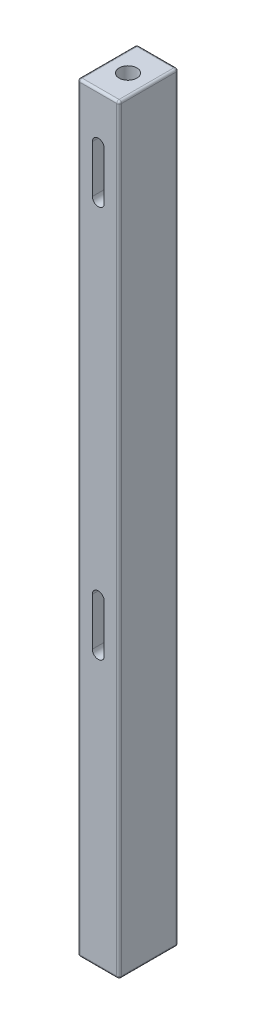
ISO-10303-21;
HEADER;
FILE_DESCRIPTION(('STEP AP214'),'2;1');
FILE_NAME('part.step','',(''),(''),'','','');
FILE_SCHEMA(('AUTOMOTIVE_DESIGN { 1 0 10303 214 1 1 1 1 }'));
ENDSEC;
DATA;
#1=APPLICATION_CONTEXT('core data for automotive mechanical design processes');
#2=APPLICATION_PROTOCOL_DEFINITION('international standard','automotive_design',2000,#1);
#3=PRODUCT_CONTEXT('',#1,'mechanical');
#4=PRODUCT('Part','Part','',(#3));
#5=PRODUCT_RELATED_PRODUCT_CATEGORY('part','',(#4));
#6=PRODUCT_DEFINITION_FORMATION('','',#4);
#7=PRODUCT_DEFINITION_CONTEXT('part definition',#1,'design');
#8=PRODUCT_DEFINITION('design','',#6,#7);
#9=PRODUCT_DEFINITION_SHAPE('','',#8);
#10=(LENGTH_UNIT() NAMED_UNIT(*) SI_UNIT(.MILLI.,.METRE.));
#11=(NAMED_UNIT(*) PLANE_ANGLE_UNIT() SI_UNIT($,.RADIAN.));
#12=(NAMED_UNIT(*) SI_UNIT($,.STERADIAN.) SOLID_ANGLE_UNIT());
#13=UNCERTAINTY_MEASURE_WITH_UNIT(LENGTH_MEASURE(1.E-05),#10,'distance_accuracy_value','');
#14=(GEOMETRIC_REPRESENTATION_CONTEXT(3) GLOBAL_UNCERTAINTY_ASSIGNED_CONTEXT((#13)) GLOBAL_UNIT_ASSIGNED_CONTEXT((#10,
#11,#12)) REPRESENTATION_CONTEXT('',''));
#15=CARTESIAN_POINT('',(0.,0.,0.));
#16=DIRECTION('',(0.,0.,1.));
#17=DIRECTION('',(1.,0.,0.));
#18=AXIS2_PLACEMENT_3D('',#15,#16,#17);
#19=CARTESIAN_POINT('',(-22.225,812.8,31.75));
#20=DIRECTION('',(1.,0.,0.));
#21=DIRECTION('',(0.,0.,-1.));
#22=AXIS2_PLACEMENT_3D('',#19,#20,#21);
#23=PLANE('',#22);
#24=DIRECTION('',(0.,-1.,0.));
#25=VECTOR('',#24,1.);
#26=CARTESIAN_POINT('',(-22.225,738.8225,-17.4625));
#27=LINE('',#26,#25);
#28=CARTESIAN_POINT('',(-22.225,738.8225,-17.4625));
#29=VERTEX_POINT('',#28);
#30=CARTESIAN_POINT('',(-22.225,129.2225,-17.4624999999999));
#31=VERTEX_POINT('',#30);
#32=EDGE_CURVE('E282',#29,#31,#27,.T.);
#33=ORIENTED_EDGE('',*,*,#32,.F.);
#34=CARTESIAN_POINT('',(-22.225,738.8225,-9.525));
#35=DIRECTION('',(-1.,0.,0.));
#36=DIRECTION('',(0.,0.,1.));
#37=AXIS2_PLACEMENT_3D('',#34,#35,#36);
#38=CIRCLE('',#37,7.9375);
#39=CARTESIAN_POINT('',(-22.225,738.8225,-1.5875));
#40=VERTEX_POINT('',#39);
#41=EDGE_CURVE('E234',#40,#29,#38,.T.);
#42=ORIENTED_EDGE('',*,*,#41,.F.);
#43=DIRECTION('',(0.,1.,0.));
#44=VECTOR('',#43,1.);
#45=CARTESIAN_POINT('',(-22.225,738.8225,-1.5875));
#46=LINE('',#45,#44);
#47=CARTESIAN_POINT('',(-22.225,129.2225,-1.58749999999992));
#48=VERTEX_POINT('',#47);
#49=EDGE_CURVE('E271',#48,#40,#46,.T.);
#50=ORIENTED_EDGE('',*,*,#49,.F.);
#51=CARTESIAN_POINT('',(-22.225,129.2225,-9.52499999999992));
#52=DIRECTION('',(-1.,0.,0.));
#53=DIRECTION('',(0.,0.,1.));
#54=AXIS2_PLACEMENT_3D('',#51,#52,#53);
#55=CIRCLE('',#54,7.9375);
#56=EDGE_CURVE('E285',#31,#48,#55,.T.);
#57=ORIENTED_EDGE('',*,*,#56,.F.);
#58=EDGE_LOOP('',(#33,#42,#50,#57));
#59=FACE_BOUND('',#58,.T.);
#60=DIRECTION('',(0.,0.,1.));
#61=VECTOR('',#60,1.);
#62=CARTESIAN_POINT('',(-22.225,810.26,-31.75));
#63=LINE('',#62,#61);
#64=CARTESIAN_POINT('',(-22.225,810.26,29.21));
#65=VERTEX_POINT('',#64);
#66=CARTESIAN_POINT('',(-22.225,810.26,-29.21));
#67=VERTEX_POINT('',#66);
#68=EDGE_CURVE('E343',#65,#67,#63,.F.);
#69=ORIENTED_EDGE('',*,*,#68,.T.);
#70=DIRECTION('',(0.,-1.,0.));
#71=VECTOR('',#70,1.);
#72=CARTESIAN_POINT('',(-22.225,812.8,-29.21));
#73=LINE('',#72,#71);
#74=CARTESIAN_POINT('',(-22.225,2.53999999999999,-29.21));
#75=VERTEX_POINT('',#74);
#76=EDGE_CURVE('E348',#67,#75,#73,.T.);
#77=ORIENTED_EDGE('',*,*,#76,.T.);
#78=DIRECTION('',(0.,0.,1.));
#79=VECTOR('',#78,1.);
#80=CARTESIAN_POINT('',(-22.225,2.53999999999999,31.75));
#81=LINE('',#80,#79);
#82=CARTESIAN_POINT('',(-22.225,2.53999999999999,29.21));
#83=VERTEX_POINT('',#82);
#84=EDGE_CURVE('E345',#75,#83,#81,.T.);
#85=ORIENTED_EDGE('',*,*,#84,.T.);
#86=DIRECTION('',(0.,-1.,0.));
#87=VECTOR('',#86,1.);
#88=CARTESIAN_POINT('',(-22.225,812.8,29.21));
#89=LINE('',#88,#87);
#90=EDGE_CURVE('E341',#83,#65,#89,.F.);
#91=ORIENTED_EDGE('',*,*,#90,.T.);
#92=EDGE_LOOP('',(#69,#77,#85,#91));
#93=FACE_BOUND('',#92,.T.);
#94=ADVANCED_FACE('F35',(#59,#93),#23,.F.);
#95=CARTESIAN_POINT('',(22.225,812.8,31.75));
#96=DIRECTION('',(0.,0.,-1.));
#97=DIRECTION('',(-1.,0.,0.));
#98=AXIS2_PLACEMENT_3D('',#95,#96,#97);
#99=PLANE('',#98);
#100=DIRECTION('',(0.,-1.,0.));
#101=VECTOR('',#100,1.);
#102=CARTESIAN_POINT('',(-6.35000000000003,342.9,31.75));
#103=LINE('',#102,#101);
#104=CARTESIAN_POINT('',(-6.35000000000003,342.9,31.75));
#105=VERTEX_POINT('',#104);
#106=CARTESIAN_POINT('',(-6.34999999999997,292.1,31.75));
#107=VERTEX_POINT('',#106);
#108=EDGE_CURVE('E227',#105,#107,#103,.T.);
#109=ORIENTED_EDGE('',*,*,#108,.F.);
#110=CARTESIAN_POINT('',(0.,342.9,31.75));
#111=DIRECTION('',(0.,0.,1.));
#112=DIRECTION('',(1.,0.,0.));
#113=AXIS2_PLACEMENT_3D('',#110,#111,#112);
#114=CIRCLE('',#113,6.35);
#115=CARTESIAN_POINT('',(6.34999999999997,342.9,31.75));
#116=VERTEX_POINT('',#115);
#117=EDGE_CURVE('E52',#116,#105,#114,.T.);
#118=ORIENTED_EDGE('',*,*,#117,.F.);
#119=DIRECTION('',(0.,1.,0.));
#120=VECTOR('',#119,1.);
#121=CARTESIAN_POINT('',(6.34999999999997,342.9,31.75));
#122=LINE('',#121,#120);
#123=CARTESIAN_POINT('',(6.34999999999997,292.1,31.75));
#124=VERTEX_POINT('',#123);
#125=EDGE_CURVE('E218',#124,#116,#122,.T.);
#126=ORIENTED_EDGE('',*,*,#125,.F.);
#127=CARTESIAN_POINT('',(0.,292.1,31.75));
#128=DIRECTION('',(0.,0.,1.));
#129=DIRECTION('',(1.,0.,0.));
#130=AXIS2_PLACEMENT_3D('',#127,#128,#129);
#131=CIRCLE('',#130,6.35);
#132=EDGE_CURVE('E221',#107,#124,#131,.T.);
#133=ORIENTED_EDGE('',*,*,#132,.F.);
#134=EDGE_LOOP('',(#109,#118,#126,#133));
#135=FACE_BOUND('',#134,.T.);
#136=DIRECTION('',(0.,-1.,0.));
#137=VECTOR('',#136,1.);
#138=CARTESIAN_POINT('',(-6.35000000000008,762.,31.75));
#139=LINE('',#138,#137);
#140=CARTESIAN_POINT('',(-6.35000000000008,762.,31.75));
#141=VERTEX_POINT('',#140);
#142=CARTESIAN_POINT('',(-6.35000000000006,711.2,31.75));
#143=VERTEX_POINT('',#142);
#144=EDGE_CURVE('E253',#141,#143,#139,.T.);
#145=ORIENTED_EDGE('',*,*,#144,.F.);
#146=CARTESIAN_POINT('',(0.,762.,31.75));
#147=DIRECTION('',(0.,0.,1.));
#148=DIRECTION('',(1.,0.,0.));
#149=AXIS2_PLACEMENT_3D('',#146,#147,#148);
#150=CIRCLE('',#149,6.35);
#151=CARTESIAN_POINT('',(6.34999999999992,762.,31.75));
#152=VERTEX_POINT('',#151);
#153=EDGE_CURVE('E60',#152,#141,#150,.T.);
#154=ORIENTED_EDGE('',*,*,#153,.F.);
#155=DIRECTION('',(0.,1.,0.));
#156=VECTOR('',#155,1.);
#157=CARTESIAN_POINT('',(6.34999999999992,762.,31.75));
#158=LINE('',#157,#156);
#159=CARTESIAN_POINT('',(6.34999999999993,711.2,31.75));
#160=VERTEX_POINT('',#159);
#161=EDGE_CURVE('E242',#160,#152,#158,.T.);
#162=ORIENTED_EDGE('',*,*,#161,.F.);
#163=CARTESIAN_POINT('',(0.,711.2,31.75));
#164=DIRECTION('',(0.,0.,1.));
#165=DIRECTION('',(1.,0.,0.));
#166=AXIS2_PLACEMENT_3D('',#163,#164,#165);
#167=CIRCLE('',#166,6.35);
#168=EDGE_CURVE('E256',#143,#160,#167,.T.);
#169=ORIENTED_EDGE('',*,*,#168,.F.);
#170=EDGE_LOOP('',(#145,#154,#162,#169));
#171=FACE_BOUND('',#170,.T.);
#172=DIRECTION('',(1.,0.,0.));
#173=VECTOR('',#172,1.);
#174=CARTESIAN_POINT('',(22.225,2.53999999999999,31.75));
#175=LINE('',#174,#173);
#176=CARTESIAN_POINT('',(-19.685,2.53999999999999,31.75));
#177=VERTEX_POINT('',#176);
#178=CARTESIAN_POINT('',(19.685,2.53999999999999,31.75));
#179=VERTEX_POINT('',#178);
#180=EDGE_CURVE('E309',#177,#179,#175,.T.);
#181=ORIENTED_EDGE('',*,*,#180,.T.);
#182=DIRECTION('',(0.,-1.,0.));
#183=VECTOR('',#182,1.);
#184=CARTESIAN_POINT('',(19.685,812.8,31.75));
#185=LINE('',#184,#183);
#186=CARTESIAN_POINT('',(19.685,810.26,31.75));
#187=VERTEX_POINT('',#186);
#188=EDGE_CURVE('E312',#179,#187,#185,.F.);
#189=ORIENTED_EDGE('',*,*,#188,.T.);
#190=DIRECTION('',(1.,0.,0.));
#191=VECTOR('',#190,1.);
#192=CARTESIAN_POINT('',(-22.225,810.26,31.75));
#193=LINE('',#192,#191);
#194=CARTESIAN_POINT('',(-19.685,810.26,31.75));
#195=VERTEX_POINT('',#194);
#196=EDGE_CURVE('E307',#187,#195,#193,.F.);
#197=ORIENTED_EDGE('',*,*,#196,.T.);
#198=DIRECTION('',(0.,-1.,0.));
#199=VECTOR('',#198,1.);
#200=CARTESIAN_POINT('',(-19.685,812.8,31.75));
#201=LINE('',#200,#199);
#202=EDGE_CURVE('E305',#195,#177,#201,.T.);
#203=ORIENTED_EDGE('',*,*,#202,.T.);
#204=EDGE_LOOP('',(#181,#189,#197,#203));
#205=FACE_BOUND('',#204,.T.);
#206=ADVANCED_FACE('F499',(#135,#171,#205),#99,.F.);
#207=CARTESIAN_POINT('',(22.225,812.8,31.75));
#208=DIRECTION('',(-1.,0.,0.));
#209=DIRECTION('',(0.,0.,1.));
#210=AXIS2_PLACEMENT_3D('',#207,#208,#209);
#211=PLANE('',#210);
#212=DIRECTION('',(0.,0.,-1.));
#213=VECTOR('',#212,1.);
#214=CARTESIAN_POINT('',(22.225,2.53999999999999,31.75));
#215=LINE('',#214,#213);
#216=CARTESIAN_POINT('',(22.225,2.53999999999999,29.21));
#217=VERTEX_POINT('',#216);
#218=CARTESIAN_POINT('',(22.225,2.53999999999999,-29.21));
#219=VERTEX_POINT('',#218);
#220=EDGE_CURVE('E327',#217,#219,#215,.T.);
#221=ORIENTED_EDGE('',*,*,#220,.T.);
#222=DIRECTION('',(0.,-1.,0.));
#223=VECTOR('',#222,1.);
#224=CARTESIAN_POINT('',(22.225,812.8,-29.21));
#225=LINE('',#224,#223);
#226=CARTESIAN_POINT('',(22.225,810.26,-29.21));
#227=VERTEX_POINT('',#226);
#228=EDGE_CURVE('E330',#219,#227,#225,.F.);
#229=ORIENTED_EDGE('',*,*,#228,.T.);
#230=DIRECTION('',(0.,0.,-1.));
#231=VECTOR('',#230,1.);
#232=CARTESIAN_POINT('',(22.225,810.26,31.75));
#233=LINE('',#232,#231);
#234=CARTESIAN_POINT('',(22.225,810.26,29.21));
#235=VERTEX_POINT('',#234);
#236=EDGE_CURVE('E325',#227,#235,#233,.F.);
#237=ORIENTED_EDGE('',*,*,#236,.T.);
#238=DIRECTION('',(0.,-1.,0.));
#239=VECTOR('',#238,1.);
#240=CARTESIAN_POINT('',(22.225,812.8,29.21));
#241=LINE('',#240,#239);
#242=EDGE_CURVE('E323',#235,#217,#241,.T.);
#243=ORIENTED_EDGE('',*,*,#242,.T.);
#244=EDGE_LOOP('',(#221,#229,#237,#243));
#245=FACE_BOUND('',#244,.T.);
#246=ADVANCED_FACE('F507',(#245),#211,.F.);
#247=CARTESIAN_POINT('',(22.225,812.8,-31.75));
#248=DIRECTION('',(0.,0.,1.));
#249=DIRECTION('',(1.,0.,0.));
#250=AXIS2_PLACEMENT_3D('',#247,#248,#249);
#251=PLANE('',#250);
#252=DIRECTION('',(-1.,0.,0.));
#253=VECTOR('',#252,1.);
#254=CARTESIAN_POINT('',(22.225,2.53999999999999,-31.75));
#255=LINE('',#254,#253);
#256=CARTESIAN_POINT('',(19.685,2.53999999999999,-31.75));
#257=VERTEX_POINT('',#256);
#258=CARTESIAN_POINT('',(-19.685,2.53999999999999,-31.75));
#259=VERTEX_POINT('',#258);
#260=EDGE_CURVE('E336',#257,#259,#255,.T.);
#261=ORIENTED_EDGE('',*,*,#260,.T.);
#262=DIRECTION('',(0.,-1.,0.));
#263=VECTOR('',#262,1.);
#264=CARTESIAN_POINT('',(-19.685,812.8,-31.75));
#265=LINE('',#264,#263);
#266=CARTESIAN_POINT('',(-19.685,810.26,-31.75));
#267=VERTEX_POINT('',#266);
#268=EDGE_CURVE('E339',#259,#267,#265,.F.);
#269=ORIENTED_EDGE('',*,*,#268,.T.);
#270=DIRECTION('',(-1.,0.,0.));
#271=VECTOR('',#270,1.);
#272=CARTESIAN_POINT('',(22.225,810.26,-31.75));
#273=LINE('',#272,#271);
#274=CARTESIAN_POINT('',(19.685,810.26,-31.75));
#275=VERTEX_POINT('',#274);
#276=EDGE_CURVE('E334',#267,#275,#273,.F.);
#277=ORIENTED_EDGE('',*,*,#276,.T.);
#278=DIRECTION('',(0.,-1.,0.));
#279=VECTOR('',#278,1.);
#280=CARTESIAN_POINT('',(19.685,812.8,-31.75));
#281=LINE('',#280,#279);
#282=EDGE_CURVE('E332',#275,#257,#281,.T.);
#283=ORIENTED_EDGE('',*,*,#282,.T.);
#284=EDGE_LOOP('',(#261,#269,#277,#283));
#285=FACE_BOUND('',#284,.T.);
#286=ADVANCED_FACE('F468',(#285),#251,.F.);
#287=CARTESIAN_POINT('',(0.,812.8,0.));
#288=DIRECTION('',(0.,1.,0.));
#289=DIRECTION('',(0.,0.,1.));
#290=AXIS2_PLACEMENT_3D('',#287,#288,#289);
#291=PLANE('',#290);
#292=CARTESIAN_POINT('',(0.,812.8,0.));
#293=DIRECTION('',(0.,1.,0.));
#294=DIRECTION('',(0.,0.,1.));
#295=AXIS2_PLACEMENT_3D('',#292,#293,#294);
#296=CIRCLE('',#295,9.525);
#297=CARTESIAN_POINT('',(0.,812.8,9.525));
#298=VERTEX_POINT('',#297);
#299=EDGE_CURVE('E292',#298,#298,#296,.T.);
#300=ORIENTED_EDGE('',*,*,#299,.F.);
#301=EDGE_LOOP('',(#300));
#302=FACE_BOUND('',#301,.T.);
#303=DIRECTION('',(0.,0.,-1.));
#304=VECTOR('',#303,1.);
#305=CARTESIAN_POINT('',(19.685,812.8,-31.75));
#306=LINE('',#305,#304);
#307=CARTESIAN_POINT('',(19.685,812.8,29.21));
#308=VERTEX_POINT('',#307);
#309=CARTESIAN_POINT('',(19.685,812.8,-29.21));
#310=VERTEX_POINT('',#309);
#311=EDGE_CURVE('E44',#308,#310,#306,.T.);
#312=ORIENTED_EDGE('',*,*,#311,.T.);
#313=DIRECTION('',(-1.,0.,0.));
#314=VECTOR('',#313,1.);
#315=CARTESIAN_POINT('',(-22.225,812.8,-29.21));
#316=LINE('',#315,#314);
#317=CARTESIAN_POINT('',(-19.685,812.8,-29.21));
#318=VERTEX_POINT('',#317);
#319=EDGE_CURVE('E11',#310,#318,#316,.T.);
#320=ORIENTED_EDGE('',*,*,#319,.T.);
#321=DIRECTION('',(0.,0.,1.));
#322=VECTOR('',#321,1.);
#323=CARTESIAN_POINT('',(-19.685,812.8,31.75));
#324=LINE('',#323,#322);
#325=CARTESIAN_POINT('',(-19.685,812.8,29.21));
#326=VERTEX_POINT('',#325);
#327=EDGE_CURVE('E350',#318,#326,#324,.T.);
#328=ORIENTED_EDGE('',*,*,#327,.T.);
#329=DIRECTION('',(1.,0.,0.));
#330=VECTOR('',#329,1.);
#331=CARTESIAN_POINT('',(22.225,812.8,29.21));
#332=LINE('',#331,#330);
#333=EDGE_CURVE('E352',#326,#308,#332,.T.);
#334=ORIENTED_EDGE('',*,*,#333,.T.);
#335=EDGE_LOOP('',(#312,#320,#328,#334));
#336=FACE_BOUND('',#335,.T.);
#337=ADVANCED_FACE('F444',(#302,#336),#291,.T.);
#338=CARTESIAN_POINT('',(0.,0.,0.));
#339=DIRECTION('',(0.,1.,0.));
#340=DIRECTION('',(0.,0.,1.));
#341=AXIS2_PLACEMENT_3D('',#338,#339,#340);
#342=PLANE('',#341);
#343=DIRECTION('',(0.,0.,-1.));
#344=VECTOR('',#343,1.);
#345=CARTESIAN_POINT('',(19.685,0.,0.));
#346=LINE('',#345,#344);
#347=CARTESIAN_POINT('',(19.685,0.,-29.21));
#348=VERTEX_POINT('',#347);
#349=CARTESIAN_POINT('',(19.685,0.,29.21));
#350=VERTEX_POINT('',#349);
#351=EDGE_CURVE('E318',#348,#350,#346,.F.);
#352=ORIENTED_EDGE('',*,*,#351,.T.);
#353=DIRECTION('',(1.,0.,0.));
#354=VECTOR('',#353,1.);
#355=CARTESIAN_POINT('',(0.,0.,29.21));
#356=LINE('',#355,#354);
#357=CARTESIAN_POINT('',(-19.685,0.,29.21));
#358=VERTEX_POINT('',#357);
#359=EDGE_CURVE('E320',#350,#358,#356,.F.);
#360=ORIENTED_EDGE('',*,*,#359,.T.);
#361=DIRECTION('',(0.,0.,1.));
#362=VECTOR('',#361,1.);
#363=CARTESIAN_POINT('',(-19.685,0.,0.));
#364=LINE('',#363,#362);
#365=CARTESIAN_POINT('',(-19.685,0.,-29.21));
#366=VERTEX_POINT('',#365);
#367=EDGE_CURVE('E314',#358,#366,#364,.F.);
#368=ORIENTED_EDGE('',*,*,#367,.T.);
#369=DIRECTION('',(-1.,0.,0.));
#370=VECTOR('',#369,1.);
#371=CARTESIAN_POINT('',(0.,0.,-29.21));
#372=LINE('',#371,#370);
#373=EDGE_CURVE('E316',#366,#348,#372,.F.);
#374=ORIENTED_EDGE('',*,*,#373,.T.);
#375=EDGE_LOOP('',(#352,#360,#368,#374));
#376=FACE_BOUND('',#375,.T.);
#377=ADVANCED_FACE('F546',(#376),#342,.F.);
#378=CARTESIAN_POINT('',(0.,810.26,-29.21));
#379=DIRECTION('',(1.,0.,0.));
#380=DIRECTION('',(0.,0.,-1.));
#381=AXIS2_PLACEMENT_3D('',#378,#379,#380);
#382=CYLINDRICAL_SURFACE('',#381,2.54);
#383=CARTESIAN_POINT('',(-19.685,810.26,-29.21));
#384=DIRECTION('',(-1.,0.,0.));
#385=DIRECTION('',(0.,0.,1.));
#386=AXIS2_PLACEMENT_3D('',#383,#384,#385);
#387=CIRCLE('',#386,2.54);
#388=EDGE_CURVE('E39',#318,#267,#387,.T.);
#389=ORIENTED_EDGE('',*,*,#388,.F.);
#390=ORIENTED_EDGE('',*,*,#319,.F.);
#391=CARTESIAN_POINT('',(19.685,810.26,-29.21));
#392=DIRECTION('',(1.,0.,0.));
#393=DIRECTION('',(0.,0.,-1.));
#394=AXIS2_PLACEMENT_3D('',#391,#392,#393);
#395=CIRCLE('',#394,2.54);
#396=EDGE_CURVE('E414',#275,#310,#395,.T.);
#397=ORIENTED_EDGE('',*,*,#396,.F.);
#398=ORIENTED_EDGE('',*,*,#276,.F.);
#399=EDGE_LOOP('',(#389,#390,#397,#398));
#400=FACE_BOUND('',#399,.T.);
#401=ADVANCED_FACE('F37',(#400),#382,.T.);
#402=CARTESIAN_POINT('',(-19.685,810.26,-29.21));
#403=DIRECTION('',(0.,0.,1.));
#404=DIRECTION('',(1.,0.,0.));
#405=AXIS2_PLACEMENT_3D('',#402,#403,#404);
#406=SPHERICAL_SURFACE('',#405,2.54);
#407=CARTESIAN_POINT('',(-19.685,810.26,-29.21));
#408=DIRECTION('',(0.,0.,-1.));
#409=DIRECTION('',(-1.,0.,0.));
#410=AXIS2_PLACEMENT_3D('',#407,#408,#409);
#411=CIRCLE('',#410,2.54);
#412=EDGE_CURVE('E409',#318,#67,#411,.F.);
#413=ORIENTED_EDGE('',*,*,#412,.F.);
#414=ORIENTED_EDGE('',*,*,#388,.T.);
#415=CARTESIAN_POINT('',(-19.685,810.26,-29.21));
#416=DIRECTION('',(0.,1.,0.));
#417=DIRECTION('',(0.,0.,1.));
#418=AXIS2_PLACEMENT_3D('',#415,#416,#417);
#419=CIRCLE('',#418,2.54);
#420=EDGE_CURVE('E412',#67,#267,#419,.F.);
#421=ORIENTED_EDGE('',*,*,#420,.F.);
#422=EDGE_LOOP('',(#413,#414,#421));
#423=FACE_BOUND('',#422,.T.);
#424=ADVANCED_FACE('F425',(#423),#406,.T.);
#425=CARTESIAN_POINT('',(19.685,810.26,-29.21));
#426=DIRECTION('',(0.,0.,1.));
#427=DIRECTION('',(1.,0.,0.));
#428=AXIS2_PLACEMENT_3D('',#425,#426,#427);
#429=SPHERICAL_SURFACE('',#428,2.54);
#430=CARTESIAN_POINT('',(19.685,810.26,-29.21));
#431=DIRECTION('',(0.,1.,0.));
#432=DIRECTION('',(0.,0.,1.));
#433=AXIS2_PLACEMENT_3D('',#430,#431,#432);
#434=CIRCLE('',#433,2.54);
#435=EDGE_CURVE('E403',#275,#227,#434,.F.);
#436=ORIENTED_EDGE('',*,*,#435,.F.);
#437=ORIENTED_EDGE('',*,*,#396,.T.);
#438=CARTESIAN_POINT('',(19.685,810.26,-29.21));
#439=DIRECTION('',(0.,0.,-1.));
#440=DIRECTION('',(-1.,0.,0.));
#441=AXIS2_PLACEMENT_3D('',#438,#439,#440);
#442=CIRCLE('',#441,2.54);
#443=EDGE_CURVE('E406',#227,#310,#442,.F.);
#444=ORIENTED_EDGE('',*,*,#443,.F.);
#445=EDGE_LOOP('',(#436,#437,#444));
#446=FACE_BOUND('',#445,.T.);
#447=ADVANCED_FACE('F461',(#446),#429,.T.);
#448=CARTESIAN_POINT('',(-19.685,812.8,-29.21));
#449=DIRECTION('',(0.,-1.,0.));
#450=DIRECTION('',(0.,0.,-1.));
#451=AXIS2_PLACEMENT_3D('',#448,#449,#450);
#452=CYLINDRICAL_SURFACE('',#451,2.54);
#453=ORIENTED_EDGE('',*,*,#420,.T.);
#454=ORIENTED_EDGE('',*,*,#268,.F.);
#455=CARTESIAN_POINT('',(-19.685,2.53999999999999,-29.21));
#456=DIRECTION('',(0.,-1.,0.));
#457=DIRECTION('',(0.,0.,-1.));
#458=AXIS2_PLACEMENT_3D('',#455,#456,#457);
#459=CIRCLE('',#458,2.54);
#460=EDGE_CURVE('E398',#75,#259,#459,.T.);
#461=ORIENTED_EDGE('',*,*,#460,.F.);
#462=ORIENTED_EDGE('',*,*,#76,.F.);
#463=EDGE_LOOP('',(#453,#454,#461,#462));
#464=FACE_BOUND('',#463,.T.);
#465=ADVANCED_FACE('F432',(#464),#452,.T.);
#466=CARTESIAN_POINT('',(-19.685,810.26,0.));
#467=DIRECTION('',(0.,0.,-1.));
#468=DIRECTION('',(-1.,0.,0.));
#469=AXIS2_PLACEMENT_3D('',#466,#467,#468);
#470=CYLINDRICAL_SURFACE('',#469,2.54);
#471=ORIENTED_EDGE('',*,*,#412,.T.);
#472=ORIENTED_EDGE('',*,*,#68,.F.);
#473=CARTESIAN_POINT('',(-19.685,810.26,29.21));
#474=DIRECTION('',(0.,0.,1.));
#475=DIRECTION('',(1.,0.,0.));
#476=AXIS2_PLACEMENT_3D('',#473,#474,#475);
#477=CIRCLE('',#476,2.54);
#478=EDGE_CURVE('E395',#326,#65,#477,.T.);
#479=ORIENTED_EDGE('',*,*,#478,.F.);
#480=ORIENTED_EDGE('',*,*,#327,.F.);
#481=EDGE_LOOP('',(#471,#472,#479,#480));
#482=FACE_BOUND('',#481,.T.);
#483=ADVANCED_FACE('F441',(#482),#470,.T.);
#484=CARTESIAN_POINT('',(0.,810.26,29.21));
#485=DIRECTION('',(-1.,0.,0.));
#486=DIRECTION('',(0.,0.,1.));
#487=AXIS2_PLACEMENT_3D('',#484,#485,#486);
#488=CYLINDRICAL_SURFACE('',#487,2.54);
#489=CARTESIAN_POINT('',(19.685,810.26,29.21));
#490=DIRECTION('',(1.,0.,0.));
#491=DIRECTION('',(0.,0.,-1.));
#492=AXIS2_PLACEMENT_3D('',#489,#490,#491);
#493=CIRCLE('',#492,2.54);
#494=EDGE_CURVE('E389',#308,#187,#493,.T.);
#495=ORIENTED_EDGE('',*,*,#494,.F.);
#496=ORIENTED_EDGE('',*,*,#333,.F.);
#497=CARTESIAN_POINT('',(-19.685,810.26,29.21));
#498=DIRECTION('',(-1.,0.,0.));
#499=DIRECTION('',(0.,0.,1.));
#500=AXIS2_PLACEMENT_3D('',#497,#498,#499);
#501=CIRCLE('',#500,2.54);
#502=EDGE_CURVE('E392',#195,#326,#501,.T.);
#503=ORIENTED_EDGE('',*,*,#502,.F.);
#504=ORIENTED_EDGE('',*,*,#196,.F.);
#505=EDGE_LOOP('',(#495,#496,#503,#504));
#506=FACE_BOUND('',#505,.T.);
#507=ADVANCED_FACE('F449',(#506),#488,.T.);
#508=CARTESIAN_POINT('',(19.685,810.26,0.));
#509=DIRECTION('',(0.,0.,1.));
#510=DIRECTION('',(1.,0.,0.));
#511=AXIS2_PLACEMENT_3D('',#508,#509,#510);
#512=CYLINDRICAL_SURFACE('',#511,2.54);
#513=ORIENTED_EDGE('',*,*,#443,.T.);
#514=ORIENTED_EDGE('',*,*,#311,.F.);
#515=CARTESIAN_POINT('',(19.685,810.26,29.21));
#516=DIRECTION('',(0.,0.,1.));
#517=DIRECTION('',(1.,0.,0.));
#518=AXIS2_PLACEMENT_3D('',#515,#516,#517);
#519=CIRCLE('',#518,2.54);
#520=EDGE_CURVE('E386',#235,#308,#519,.T.);
#521=ORIENTED_EDGE('',*,*,#520,.F.);
#522=ORIENTED_EDGE('',*,*,#236,.F.);
#523=EDGE_LOOP('',(#513,#514,#521,#522));
#524=FACE_BOUND('',#523,.T.);
#525=ADVANCED_FACE('F459',(#524),#512,.T.);
#526=CARTESIAN_POINT('',(19.685,812.8,-29.21));
#527=DIRECTION('',(0.,-1.,0.));
#528=DIRECTION('',(0.,0.,-1.));
#529=AXIS2_PLACEMENT_3D('',#526,#527,#528);
#530=CYLINDRICAL_SURFACE('',#529,2.54);
#531=ORIENTED_EDGE('',*,*,#435,.T.);
#532=ORIENTED_EDGE('',*,*,#228,.F.);
#533=CARTESIAN_POINT('',(19.685,2.53999999999999,-29.21));
#534=DIRECTION('',(0.,-1.,0.));
#535=DIRECTION('',(0.,0.,-1.));
#536=AXIS2_PLACEMENT_3D('',#533,#534,#535);
#537=CIRCLE('',#536,2.54);
#538=EDGE_CURVE('E383',#257,#219,#537,.T.);
#539=ORIENTED_EDGE('',*,*,#538,.F.);
#540=ORIENTED_EDGE('',*,*,#282,.F.);
#541=EDGE_LOOP('',(#531,#532,#539,#540));
#542=FACE_BOUND('',#541,.T.);
#543=ADVANCED_FACE('F465',(#542),#530,.T.);
#544=CARTESIAN_POINT('',(22.225,2.53999999999999,-29.21));
#545=DIRECTION('',(-1.,0.,0.));
#546=DIRECTION('',(0.,0.,1.));
#547=AXIS2_PLACEMENT_3D('',#544,#545,#546);
#548=CYLINDRICAL_SURFACE('',#547,2.54);
#549=CARTESIAN_POINT('',(-19.685,2.53999999999999,-29.21));
#550=DIRECTION('',(-1.,0.,0.));
#551=DIRECTION('',(0.,0.,1.));
#552=AXIS2_PLACEMENT_3D('',#549,#550,#551);
#553=CIRCLE('',#552,2.54);
#554=EDGE_CURVE('E400',#259,#366,#553,.T.);
#555=ORIENTED_EDGE('',*,*,#554,.F.);
#556=ORIENTED_EDGE('',*,*,#260,.F.);
#557=CARTESIAN_POINT('',(19.685,2.54,-29.21));
#558=DIRECTION('',(1.,0.,0.));
#559=DIRECTION('',(0.,0.,-1.));
#560=AXIS2_PLACEMENT_3D('',#557,#558,#559);
#561=CIRCLE('',#560,2.54);
#562=EDGE_CURVE('E380',#348,#257,#561,.T.);
#563=ORIENTED_EDGE('',*,*,#562,.F.);
#564=ORIENTED_EDGE('',*,*,#373,.F.);
#565=EDGE_LOOP('',(#555,#556,#563,#564));
#566=FACE_BOUND('',#565,.T.);
#567=ADVANCED_FACE('F472',(#566),#548,.T.);
#568=CARTESIAN_POINT('',(-19.685,2.54,-29.21));
#569=DIRECTION('',(0.,0.,1.));
#570=DIRECTION('',(1.,0.,0.));
#571=AXIS2_PLACEMENT_3D('',#568,#569,#570);
#572=SPHERICAL_SURFACE('',#571,2.54);
#573=ORIENTED_EDGE('',*,*,#460,.T.);
#574=ORIENTED_EDGE('',*,*,#554,.T.);
#575=CARTESIAN_POINT('',(-19.685,2.54,-29.21));
#576=DIRECTION('',(0.,0.,-1.));
#577=DIRECTION('',(-1.,0.,0.));
#578=AXIS2_PLACEMENT_3D('',#575,#576,#577);
#579=CIRCLE('',#578,2.54);
#580=EDGE_CURVE('E377',#75,#366,#579,.F.);
#581=ORIENTED_EDGE('',*,*,#580,.F.);
#582=EDGE_LOOP('',(#573,#574,#581));
#583=FACE_BOUND('',#582,.T.);
#584=ADVANCED_FACE('F476',(#583),#572,.T.);
#585=CARTESIAN_POINT('',(-19.685,810.26,29.21));
#586=DIRECTION('',(0.,0.,1.));
#587=DIRECTION('',(1.,0.,0.));
#588=AXIS2_PLACEMENT_3D('',#585,#586,#587);
#589=SPHERICAL_SURFACE('',#588,2.54);
#590=ORIENTED_EDGE('',*,*,#502,.T.);
#591=ORIENTED_EDGE('',*,*,#478,.T.);
#592=CARTESIAN_POINT('',(-19.685,810.26,29.21));
#593=DIRECTION('',(0.,1.,0.));
#594=DIRECTION('',(0.,0.,1.));
#595=AXIS2_PLACEMENT_3D('',#592,#593,#594);
#596=CIRCLE('',#595,2.54);
#597=EDGE_CURVE('E374',#195,#65,#596,.F.);
#598=ORIENTED_EDGE('',*,*,#597,.F.);
#599=EDGE_LOOP('',(#590,#591,#598));
#600=FACE_BOUND('',#599,.T.);
#601=ADVANCED_FACE('F488',(#600),#589,.T.);
#602=CARTESIAN_POINT('',(19.685,810.26,29.21));
#603=DIRECTION('',(0.,0.,1.));
#604=DIRECTION('',(1.,0.,0.));
#605=AXIS2_PLACEMENT_3D('',#602,#603,#604);
#606=SPHERICAL_SURFACE('',#605,2.54);
#607=ORIENTED_EDGE('',*,*,#520,.T.);
#608=ORIENTED_EDGE('',*,*,#494,.T.);
#609=CARTESIAN_POINT('',(19.685,810.26,29.21));
#610=DIRECTION('',(0.,1.,0.));
#611=DIRECTION('',(0.,0.,1.));
#612=AXIS2_PLACEMENT_3D('',#609,#610,#611);
#613=CIRCLE('',#612,2.54);
#614=EDGE_CURVE('E371',#235,#187,#613,.F.);
#615=ORIENTED_EDGE('',*,*,#614,.F.);
#616=EDGE_LOOP('',(#607,#608,#615));
#617=FACE_BOUND('',#616,.T.);
#618=ADVANCED_FACE('F455',(#617),#606,.T.);
#619=CARTESIAN_POINT('',(19.685,2.54,-29.21));
#620=DIRECTION('',(0.,0.,1.));
#621=DIRECTION('',(1.,0.,0.));
#622=AXIS2_PLACEMENT_3D('',#619,#620,#621);
#623=SPHERICAL_SURFACE('',#622,2.54);
#624=ORIENTED_EDGE('',*,*,#562,.T.);
#625=ORIENTED_EDGE('',*,*,#538,.T.);
#626=CARTESIAN_POINT('',(19.685,2.53999999999999,-29.21));
#627=DIRECTION('',(0.,0.,-1.));
#628=DIRECTION('',(-1.,0.,0.));
#629=AXIS2_PLACEMENT_3D('',#626,#627,#628);
#630=CIRCLE('',#629,2.54);
#631=EDGE_CURVE('E369',#348,#219,#630,.F.);
#632=ORIENTED_EDGE('',*,*,#631,.F.);
#633=EDGE_LOOP('',(#624,#625,#632));
#634=FACE_BOUND('',#633,.T.);
#635=ADVANCED_FACE('F495',(#634),#623,.T.);
#636=CARTESIAN_POINT('',(-19.685,2.53999999999999,31.75));
#637=DIRECTION('',(0.,0.,1.));
#638=DIRECTION('',(1.,0.,0.));
#639=AXIS2_PLACEMENT_3D('',#636,#637,#638);
#640=CYLINDRICAL_SURFACE('',#639,2.54);
#641=ORIENTED_EDGE('',*,*,#580,.T.);
#642=ORIENTED_EDGE('',*,*,#367,.F.);
#643=CARTESIAN_POINT('',(-19.685,2.53999999999999,29.21));
#644=DIRECTION('',(0.,0.,1.));
#645=DIRECTION('',(1.,0.,0.));
#646=AXIS2_PLACEMENT_3D('',#643,#644,#645);
#647=CIRCLE('',#646,2.54);
#648=EDGE_CURVE('E366',#83,#358,#647,.T.);
#649=ORIENTED_EDGE('',*,*,#648,.F.);
#650=ORIENTED_EDGE('',*,*,#84,.F.);
#651=EDGE_LOOP('',(#641,#642,#649,#650));
#652=FACE_BOUND('',#651,.T.);
#653=ADVANCED_FACE('F479',(#652),#640,.T.);
#654=CARTESIAN_POINT('',(-19.685,812.8,29.21));
#655=DIRECTION('',(0.,-1.,0.));
#656=DIRECTION('',(0.,0.,-1.));
#657=AXIS2_PLACEMENT_3D('',#654,#655,#656);
#658=CYLINDRICAL_SURFACE('',#657,2.54);
#659=ORIENTED_EDGE('',*,*,#597,.T.);
#660=ORIENTED_EDGE('',*,*,#90,.F.);
#661=CARTESIAN_POINT('',(-19.685,2.53999999999999,29.21));
#662=DIRECTION('',(0.,-1.,0.));
#663=DIRECTION('',(0.,0.,-1.));
#664=AXIS2_PLACEMENT_3D('',#661,#662,#663);
#665=CIRCLE('',#664,2.54);
#666=EDGE_CURVE('E364',#177,#83,#665,.T.);
#667=ORIENTED_EDGE('',*,*,#666,.F.);
#668=ORIENTED_EDGE('',*,*,#202,.F.);
#669=EDGE_LOOP('',(#659,#660,#667,#668));
#670=FACE_BOUND('',#669,.T.);
#671=ADVANCED_FACE('F485',(#670),#658,.T.);
#672=CARTESIAN_POINT('',(19.685,812.8,29.21));
#673=DIRECTION('',(0.,-1.,0.));
#674=DIRECTION('',(0.,0.,-1.));
#675=AXIS2_PLACEMENT_3D('',#672,#673,#674);
#676=CYLINDRICAL_SURFACE('',#675,2.54);
#677=ORIENTED_EDGE('',*,*,#614,.T.);
#678=ORIENTED_EDGE('',*,*,#188,.F.);
#679=CARTESIAN_POINT('',(19.685,2.53999999999999,29.21));
#680=DIRECTION('',(0.,-1.,0.));
#681=DIRECTION('',(0.,0.,-1.));
#682=AXIS2_PLACEMENT_3D('',#679,#680,#681);
#683=CIRCLE('',#682,2.54);
#684=EDGE_CURVE('E361',#217,#179,#683,.T.);
#685=ORIENTED_EDGE('',*,*,#684,.F.);
#686=ORIENTED_EDGE('',*,*,#242,.F.);
#687=EDGE_LOOP('',(#677,#678,#685,#686));
#688=FACE_BOUND('',#687,.T.);
#689=ADVANCED_FACE('F528',(#688),#676,.T.);
#690=CARTESIAN_POINT('',(19.685,2.53999999999999,31.75));
#691=DIRECTION('',(0.,0.,-1.));
#692=DIRECTION('',(-1.,0.,0.));
#693=AXIS2_PLACEMENT_3D('',#690,#691,#692);
#694=CYLINDRICAL_SURFACE('',#693,2.54);
#695=ORIENTED_EDGE('',*,*,#631,.T.);
#696=ORIENTED_EDGE('',*,*,#220,.F.);
#697=CARTESIAN_POINT('',(19.685,2.54,29.21));
#698=DIRECTION('',(0.,0.,1.));
#699=DIRECTION('',(1.,0.,0.));
#700=AXIS2_PLACEMENT_3D('',#697,#698,#699);
#701=CIRCLE('',#700,2.54);
#702=EDGE_CURVE('E358',#350,#217,#701,.T.);
#703=ORIENTED_EDGE('',*,*,#702,.F.);
#704=ORIENTED_EDGE('',*,*,#351,.F.);
#705=EDGE_LOOP('',(#695,#696,#703,#704));
#706=FACE_BOUND('',#705,.T.);
#707=ADVANCED_FACE('F525',(#706),#694,.T.);
#708=CARTESIAN_POINT('',(-19.685,2.54,29.21));
#709=DIRECTION('',(0.,0.,1.));
#710=DIRECTION('',(1.,0.,0.));
#711=AXIS2_PLACEMENT_3D('',#708,#709,#710);
#712=SPHERICAL_SURFACE('',#711,2.54);
#713=ORIENTED_EDGE('',*,*,#666,.T.);
#714=ORIENTED_EDGE('',*,*,#648,.T.);
#715=CARTESIAN_POINT('',(-19.685,2.54,29.21));
#716=DIRECTION('',(-1.,0.,0.));
#717=DIRECTION('',(0.,0.,1.));
#718=AXIS2_PLACEMENT_3D('',#715,#716,#717);
#719=CIRCLE('',#718,2.54);
#720=EDGE_CURVE('E356',#177,#358,#719,.F.);
#721=ORIENTED_EDGE('',*,*,#720,.F.);
#722=EDGE_LOOP('',(#713,#714,#721));
#723=FACE_BOUND('',#722,.T.);
#724=ADVANCED_FACE('F521',(#723),#712,.T.);
#725=CARTESIAN_POINT('',(19.685,2.54,29.21));
#726=DIRECTION('',(0.,0.,1.));
#727=DIRECTION('',(1.,0.,0.));
#728=AXIS2_PLACEMENT_3D('',#725,#726,#727);
#729=SPHERICAL_SURFACE('',#728,2.54);
#730=ORIENTED_EDGE('',*,*,#702,.T.);
#731=ORIENTED_EDGE('',*,*,#684,.T.);
#732=CARTESIAN_POINT('',(19.685,2.53999999999999,29.21));
#733=DIRECTION('',(1.,0.,0.));
#734=DIRECTION('',(0.,0.,-1.));
#735=AXIS2_PLACEMENT_3D('',#732,#733,#734);
#736=CIRCLE('',#735,2.54);
#737=EDGE_CURVE('E302',#350,#179,#736,.F.);
#738=ORIENTED_EDGE('',*,*,#737,.F.);
#739=EDGE_LOOP('',(#730,#731,#738));
#740=FACE_BOUND('',#739,.T.);
#741=ADVANCED_FACE('F517',(#740),#729,.T.);
#742=CARTESIAN_POINT('',(22.225,2.53999999999999,29.21));
#743=DIRECTION('',(1.,0.,0.));
#744=DIRECTION('',(0.,0.,-1.));
#745=AXIS2_PLACEMENT_3D('',#742,#743,#744);
#746=CYLINDRICAL_SURFACE('',#745,2.54);
#747=ORIENTED_EDGE('',*,*,#720,.T.);
#748=ORIENTED_EDGE('',*,*,#359,.F.);
#749=ORIENTED_EDGE('',*,*,#737,.T.);
#750=ORIENTED_EDGE('',*,*,#180,.F.);
#751=EDGE_LOOP('',(#747,#748,#749,#750));
#752=FACE_BOUND('',#751,.T.);
#753=ADVANCED_FACE('F513',(#752),#746,.T.);
#754=CARTESIAN_POINT('',(0.,787.4,0.));
#755=DIRECTION('',(0.,1.,0.));
#756=DIRECTION('',(0.,0.,1.));
#757=AXIS2_PLACEMENT_3D('',#754,#755,#756);
#758=CYLINDRICAL_SURFACE('',#757,9.525);
#759=CARTESIAN_POINT('',(0.,787.4,0.));
#760=DIRECTION('',(0.,1.,0.));
#761=DIRECTION('',(0.,0.,1.));
#762=AXIS2_PLACEMENT_3D('',#759,#760,#761);
#763=CIRCLE('',#762,9.525);
#764=CARTESIAN_POINT('',(0.,787.4,9.525));
#765=VERTEX_POINT('',#764);
#766=EDGE_CURVE('E299',#765,#765,#763,.T.);
#767=ORIENTED_EDGE('',*,*,#766,.F.);
#768=EDGE_LOOP('',(#767));
#769=FACE_BOUND('',#768,.T.);
#770=ORIENTED_EDGE('',*,*,#299,.T.);
#771=EDGE_LOOP('',(#770));
#772=FACE_BOUND('',#771,.T.);
#773=ADVANCED_FACE('F516',(#769,#772),#758,.F.);
#774=CARTESIAN_POINT('',(0.,787.4,0.));
#775=DIRECTION('',(0.,1.,0.));
#776=DIRECTION('',(0.,0.,1.));
#777=AXIS2_PLACEMENT_3D('',#774,#775,#776);
#778=PLANE('',#777);
#779=ORIENTED_EDGE('',*,*,#766,.T.);
#780=EDGE_LOOP('',(#779));
#781=FACE_BOUND('',#780,.T.);
#782=ADVANCED_FACE('F567',(#781),#778,.T.);
#783=CARTESIAN_POINT('',(1.27000000000001,738.8225,-9.525));
#784=DIRECTION('',(-1.,0.,0.));
#785=DIRECTION('',(0.,0.,1.));
#786=AXIS2_PLACEMENT_3D('',#783,#784,#785);
#787=CYLINDRICAL_SURFACE('',#786,7.9375);
#788=ORIENTED_EDGE('',*,*,#41,.T.);
#789=DIRECTION('',(-1.,0.,0.));
#790=VECTOR('',#789,1.);
#791=CARTESIAN_POINT('',(1.27000000000001,738.8225,-17.4625));
#792=LINE('',#791,#790);
#793=CARTESIAN_POINT('',(1.27000000000001,738.8225,-17.4625));
#794=VERTEX_POINT('',#793);
#795=EDGE_CURVE('E280',#794,#29,#792,.T.);
#796=ORIENTED_EDGE('',*,*,#795,.F.);
#797=CARTESIAN_POINT('',(1.27000000000001,738.8225,-9.525));
#798=DIRECTION('',(-1.,0.,0.));
#799=DIRECTION('',(0.,0.,1.));
#800=AXIS2_PLACEMENT_3D('',#797,#798,#799);
#801=CIRCLE('',#800,7.9375);
#802=CARTESIAN_POINT('',(1.27000000000001,738.8225,-1.5875));
#803=VERTEX_POINT('',#802);
#804=EDGE_CURVE('E267',#803,#794,#801,.T.);
#805=ORIENTED_EDGE('',*,*,#804,.F.);
#806=DIRECTION('',(-1.,0.,0.));
#807=VECTOR('',#806,1.);
#808=CARTESIAN_POINT('',(1.27000000000001,738.8225,-1.5875));
#809=LINE('',#808,#807);
#810=EDGE_CURVE('E290',#803,#40,#809,.T.);
#811=ORIENTED_EDGE('',*,*,#810,.T.);
#812=EDGE_LOOP('',(#788,#796,#805,#811));
#813=FACE_BOUND('',#812,.T.);
#814=ADVANCED_FACE('F571',(#813),#787,.F.);
#815=CARTESIAN_POINT('',(1.27000000000001,738.8225,-1.5875));
#816=DIRECTION('',(0.,0.,1.));
#817=DIRECTION('',(0.,-1.,0.));
#818=AXIS2_PLACEMENT_3D('',#815,#816,#817);
#819=PLANE('',#818);
#820=ORIENTED_EDGE('',*,*,#49,.T.);
#821=ORIENTED_EDGE('',*,*,#810,.F.);
#822=DIRECTION('',(0.,1.,0.));
#823=VECTOR('',#822,1.);
#824=CARTESIAN_POINT('',(1.27000000000001,738.8225,-1.5875));
#825=LINE('',#824,#823);
#826=CARTESIAN_POINT('',(1.27000000000001,129.2225,-1.58749999999992));
#827=VERTEX_POINT('',#826);
#828=EDGE_CURVE('E277',#827,#803,#825,.T.);
#829=ORIENTED_EDGE('',*,*,#828,.F.);
#830=DIRECTION('',(-1.,0.,0.));
#831=VECTOR('',#830,1.);
#832=CARTESIAN_POINT('',(1.27000000000001,129.2225,-1.58749999999992));
#833=LINE('',#832,#831);
#834=EDGE_CURVE('E293',#827,#48,#833,.T.);
#835=ORIENTED_EDGE('',*,*,#834,.T.);
#836=EDGE_LOOP('',(#820,#821,#829,#835));
#837=FACE_BOUND('',#836,.T.);
#838=ADVANCED_FACE('F575',(#837),#819,.F.);
#839=CARTESIAN_POINT('',(1.27000000000001,129.2225,-9.52499999999992));
#840=DIRECTION('',(-1.,0.,0.));
#841=DIRECTION('',(0.,0.,1.));
#842=AXIS2_PLACEMENT_3D('',#839,#840,#841);
#843=CYLINDRICAL_SURFACE('',#842,7.9375);
#844=ORIENTED_EDGE('',*,*,#56,.T.);
#845=ORIENTED_EDGE('',*,*,#834,.F.);
#846=CARTESIAN_POINT('',(1.27000000000001,129.2225,-9.52499999999992));
#847=DIRECTION('',(-1.,0.,0.));
#848=DIRECTION('',(0.,0.,1.));
#849=AXIS2_PLACEMENT_3D('',#846,#847,#848);
#850=CIRCLE('',#849,7.9375);
#851=CARTESIAN_POINT('',(1.27000000000001,129.2225,-17.4624999999999));
#852=VERTEX_POINT('',#851);
#853=EDGE_CURVE('E274',#852,#827,#850,.T.);
#854=ORIENTED_EDGE('',*,*,#853,.F.);
#855=DIRECTION('',(-1.,0.,0.));
#856=VECTOR('',#855,1.);
#857=CARTESIAN_POINT('',(1.27000000000001,129.2225,-17.4624999999999));
#858=LINE('',#857,#856);
#859=EDGE_CURVE('E295',#852,#31,#858,.T.);
#860=ORIENTED_EDGE('',*,*,#859,.T.);
#861=EDGE_LOOP('',(#844,#845,#854,#860));
#862=FACE_BOUND('',#861,.T.);
#863=ADVANCED_FACE('F581',(#862),#843,.F.);
#864=CARTESIAN_POINT('',(1.27000000000001,738.8225,-17.4625));
#865=DIRECTION('',(0.,0.,-1.));
#866=DIRECTION('',(0.,1.,0.));
#867=AXIS2_PLACEMENT_3D('',#864,#865,#866);
#868=PLANE('',#867);
#869=ORIENTED_EDGE('',*,*,#32,.T.);
#870=ORIENTED_EDGE('',*,*,#859,.F.);
#871=DIRECTION('',(0.,-1.,0.));
#872=VECTOR('',#871,1.);
#873=CARTESIAN_POINT('',(1.27000000000001,738.8225,-17.4625));
#874=LINE('',#873,#872);
#875=EDGE_CURVE('E270',#794,#852,#874,.T.);
#876=ORIENTED_EDGE('',*,*,#875,.F.);
#877=ORIENTED_EDGE('',*,*,#795,.T.);
#878=EDGE_LOOP('',(#869,#870,#876,#877));
#879=FACE_BOUND('',#878,.T.);
#880=ADVANCED_FACE('F577',(#879),#868,.F.);
#881=CARTESIAN_POINT('',(1.27000000000001,738.8225,-9.525));
#882=DIRECTION('',(-1.,0.,0.));
#883=DIRECTION('',(0.,0.,1.));
#884=AXIS2_PLACEMENT_3D('',#881,#882,#883);
#885=PLANE('',#884);
#886=ORIENTED_EDGE('',*,*,#804,.T.);
#887=ORIENTED_EDGE('',*,*,#875,.T.);
#888=ORIENTED_EDGE('',*,*,#853,.T.);
#889=ORIENTED_EDGE('',*,*,#828,.T.);
#890=EDGE_LOOP('',(#886,#887,#888,#889));
#891=FACE_BOUND('',#890,.T.);
#892=ADVANCED_FACE('F580',(#891),#885,.T.);
#893=CARTESIAN_POINT('',(0.,762.,6.35));
#894=DIRECTION('',(0.,0.,1.));
#895=DIRECTION('',(1.,0.,0.));
#896=AXIS2_PLACEMENT_3D('',#893,#894,#895);
#897=CYLINDRICAL_SURFACE('',#896,6.35);
#898=ORIENTED_EDGE('',*,*,#153,.T.);
#899=DIRECTION('',(0.,0.,1.));
#900=VECTOR('',#899,1.);
#901=CARTESIAN_POINT('',(-6.35000000000008,762.,6.35));
#902=LINE('',#901,#900);
#903=CARTESIAN_POINT('',(-6.35000000000008,762.,6.35));
#904=VERTEX_POINT('',#903);
#905=EDGE_CURVE('E251',#904,#141,#902,.T.);
#906=ORIENTED_EDGE('',*,*,#905,.F.);
#907=CARTESIAN_POINT('',(0.,762.,6.35));
#908=DIRECTION('',(0.,0.,1.));
#909=DIRECTION('',(1.,0.,0.));
#910=AXIS2_PLACEMENT_3D('',#907,#908,#909);
#911=CIRCLE('',#910,6.35);
#912=CARTESIAN_POINT('',(6.34999999999992,762.,6.35));
#913=VERTEX_POINT('',#912);
#914=EDGE_CURVE('E238',#913,#904,#911,.T.);
#915=ORIENTED_EDGE('',*,*,#914,.F.);
#916=DIRECTION('',(0.,0.,1.));
#917=VECTOR('',#916,1.);
#918=CARTESIAN_POINT('',(6.34999999999992,762.,6.35));
#919=LINE('',#918,#917);
#920=EDGE_CURVE('E228',#913,#152,#919,.T.);
#921=ORIENTED_EDGE('',*,*,#920,.T.);
#922=EDGE_LOOP('',(#898,#906,#915,#921));
#923=FACE_BOUND('',#922,.T.);
#924=ADVANCED_FACE('F591',(#923),#897,.F.);
#925=CARTESIAN_POINT('',(6.34999999999992,762.,6.35));
#926=DIRECTION('',(1.,0.,0.));
#927=DIRECTION('',(0.,1.,0.));
#928=AXIS2_PLACEMENT_3D('',#925,#926,#927);
#929=PLANE('',#928);
#930=ORIENTED_EDGE('',*,*,#161,.T.);
#931=ORIENTED_EDGE('',*,*,#920,.F.);
#932=DIRECTION('',(0.,1.,0.));
#933=VECTOR('',#932,1.);
#934=CARTESIAN_POINT('',(6.34999999999992,762.,6.35));
#935=LINE('',#934,#933);
#936=CARTESIAN_POINT('',(6.34999999999993,711.2,6.35));
#937=VERTEX_POINT('',#936);
#938=EDGE_CURVE('E248',#937,#913,#935,.T.);
#939=ORIENTED_EDGE('',*,*,#938,.F.);
#940=DIRECTION('',(0.,0.,1.));
#941=VECTOR('',#940,1.);
#942=CARTESIAN_POINT('',(6.34999999999993,711.2,6.35));
#943=LINE('',#942,#941);
#944=EDGE_CURVE('E262',#937,#160,#943,.T.);
#945=ORIENTED_EDGE('',*,*,#944,.T.);
#946=EDGE_LOOP('',(#930,#931,#939,#945));
#947=FACE_BOUND('',#946,.T.);
#948=ADVANCED_FACE('F595',(#947),#929,.F.);
#949=CARTESIAN_POINT('',(0.,711.2,6.35));
#950=DIRECTION('',(0.,0.,1.));
#951=DIRECTION('',(1.,0.,0.));
#952=AXIS2_PLACEMENT_3D('',#949,#950,#951);
#953=CYLINDRICAL_SURFACE('',#952,6.35);
#954=ORIENTED_EDGE('',*,*,#168,.T.);
#955=ORIENTED_EDGE('',*,*,#944,.F.);
#956=CARTESIAN_POINT('',(0.,711.2,6.35));
#957=DIRECTION('',(0.,0.,1.));
#958=DIRECTION('',(1.,0.,0.));
#959=AXIS2_PLACEMENT_3D('',#956,#957,#958);
#960=CIRCLE('',#959,6.35);
#961=CARTESIAN_POINT('',(-6.35000000000006,711.2,6.35));
#962=VERTEX_POINT('',#961);
#963=EDGE_CURVE('E245',#962,#937,#960,.T.);
#964=ORIENTED_EDGE('',*,*,#963,.F.);
#965=DIRECTION('',(0.,0.,1.));
#966=VECTOR('',#965,1.);
#967=CARTESIAN_POINT('',(-6.35000000000006,711.2,6.35));
#968=LINE('',#967,#966);
#969=EDGE_CURVE('E264',#962,#143,#968,.T.);
#970=ORIENTED_EDGE('',*,*,#969,.T.);
#971=EDGE_LOOP('',(#954,#955,#964,#970));
#972=FACE_BOUND('',#971,.T.);
#973=ADVANCED_FACE('F600',(#972),#953,.F.);
#974=CARTESIAN_POINT('',(-6.35000000000008,762.,6.35));
#975=DIRECTION('',(-1.,0.,0.));
#976=DIRECTION('',(0.,-1.,0.));
#977=AXIS2_PLACEMENT_3D('',#974,#975,#976);
#978=PLANE('',#977);
#979=ORIENTED_EDGE('',*,*,#144,.T.);
#980=ORIENTED_EDGE('',*,*,#969,.F.);
#981=DIRECTION('',(0.,-1.,0.));
#982=VECTOR('',#981,1.);
#983=CARTESIAN_POINT('',(-6.35000000000008,762.,6.35));
#984=LINE('',#983,#982);
#985=EDGE_CURVE('E241',#904,#962,#984,.T.);
#986=ORIENTED_EDGE('',*,*,#985,.F.);
#987=ORIENTED_EDGE('',*,*,#905,.T.);
#988=EDGE_LOOP('',(#979,#980,#986,#987));
#989=FACE_BOUND('',#988,.T.);
#990=ADVANCED_FACE('F596',(#989),#978,.F.);
#991=CARTESIAN_POINT('',(0.,762.,6.35));
#992=DIRECTION('',(0.,0.,1.));
#993=DIRECTION('',(1.,0.,0.));
#994=AXIS2_PLACEMENT_3D('',#991,#992,#993);
#995=PLANE('',#994);
#996=ORIENTED_EDGE('',*,*,#914,.T.);
#997=ORIENTED_EDGE('',*,*,#985,.T.);
#998=ORIENTED_EDGE('',*,*,#963,.T.);
#999=ORIENTED_EDGE('',*,*,#938,.T.);
#1000=EDGE_LOOP('',(#996,#997,#998,#999));
#1001=FACE_BOUND('',#1000,.T.);
#1002=ADVANCED_FACE('F599',(#1001),#995,.T.);
#1003=CARTESIAN_POINT('',(0.,342.9,6.35));
#1004=DIRECTION('',(0.,0.,1.));
#1005=DIRECTION('',(1.,0.,0.));
#1006=AXIS2_PLACEMENT_3D('',#1003,#1004,#1005);
#1007=CYLINDRICAL_SURFACE('',#1006,6.35);
#1008=ORIENTED_EDGE('',*,*,#117,.T.);
#1009=DIRECTION('',(0.,0.,1.));
#1010=VECTOR('',#1009,1.);
#1011=CARTESIAN_POINT('',(-6.35000000000003,342.9,6.35));
#1012=LINE('',#1011,#1010);
#1013=CARTESIAN_POINT('',(-6.35000000000003,342.9,6.35));
#1014=VERTEX_POINT('',#1013);
#1015=EDGE_CURVE('E196',#1014,#105,#1012,.T.);
#1016=ORIENTED_EDGE('',*,*,#1015,.F.);
#1017=CARTESIAN_POINT('',(0.,342.9,6.35));
#1018=DIRECTION('',(0.,0.,1.));
#1019=DIRECTION('',(1.,0.,0.));
#1020=AXIS2_PLACEMENT_3D('',#1017,#1018,#1019);
#1021=CIRCLE('',#1020,6.35);
#1022=CARTESIAN_POINT('',(6.34999999999997,342.9,6.35));
#1023=VERTEX_POINT('',#1022);
#1024=EDGE_CURVE('E200',#1023,#1014,#1021,.T.);
#1025=ORIENTED_EDGE('',*,*,#1024,.F.);
#1026=DIRECTION('',(0.,0.,1.));
#1027=VECTOR('',#1026,1.);
#1028=CARTESIAN_POINT('',(6.34999999999997,342.9,6.35));
#1029=LINE('',#1028,#1027);
#1030=EDGE_CURVE('E232',#1023,#116,#1029,.T.);
#1031=ORIENTED_EDGE('',*,*,#1030,.T.);
#1032=EDGE_LOOP('',(#1008,#1016,#1025,#1031));
#1033=FACE_BOUND('',#1032,.T.);
#1034=ADVANCED_FACE('F198',(#1033),#1007,.F.);
#1035=CARTESIAN_POINT('',(6.34999999999997,342.9,6.35));
#1036=DIRECTION('',(1.,0.,0.));
#1037=DIRECTION('',(0.,1.,0.));
#1038=AXIS2_PLACEMENT_3D('',#1035,#1036,#1037);
#1039=PLANE('',#1038);
#1040=ORIENTED_EDGE('',*,*,#125,.T.);
#1041=ORIENTED_EDGE('',*,*,#1030,.F.);
#1042=DIRECTION('',(0.,1.,0.));
#1043=VECTOR('',#1042,1.);
#1044=CARTESIAN_POINT('',(6.34999999999997,342.9,6.35));
#1045=LINE('',#1044,#1043);
#1046=CARTESIAN_POINT('',(6.34999999999997,292.1,6.35));
#1047=VERTEX_POINT('',#1046);
#1048=EDGE_CURVE('E206',#1047,#1023,#1045,.T.);
#1049=ORIENTED_EDGE('',*,*,#1048,.F.);
#1050=DIRECTION('',(0.,0.,1.));
#1051=VECTOR('',#1050,1.);
#1052=CARTESIAN_POINT('',(6.34999999999997,292.1,6.35));
#1053=LINE('',#1052,#1051);
#1054=EDGE_CURVE('E235',#1047,#124,#1053,.T.);
#1055=ORIENTED_EDGE('',*,*,#1054,.T.);
#1056=EDGE_LOOP('',(#1040,#1041,#1049,#1055));
#1057=FACE_BOUND('',#1056,.T.);
#1058=ADVANCED_FACE('F613',(#1057),#1039,.F.);
#1059=CARTESIAN_POINT('',(0.,292.1,6.35));
#1060=DIRECTION('',(0.,0.,1.));
#1061=DIRECTION('',(1.,0.,0.));
#1062=AXIS2_PLACEMENT_3D('',#1059,#1060,#1061);
#1063=CYLINDRICAL_SURFACE('',#1062,6.35);
#1064=ORIENTED_EDGE('',*,*,#132,.T.);
#1065=ORIENTED_EDGE('',*,*,#1054,.F.);
#1066=CARTESIAN_POINT('',(0.,292.1,6.35));
#1067=DIRECTION('',(0.,0.,1.));
#1068=DIRECTION('',(1.,0.,0.));
#1069=AXIS2_PLACEMENT_3D('',#1066,#1067,#1068);
#1070=CIRCLE('',#1069,6.35);
#1071=CARTESIAN_POINT('',(-6.34999999999997,292.1,6.35));
#1072=VERTEX_POINT('',#1071);
#1073=EDGE_CURVE('E214',#1072,#1047,#1070,.T.);
#1074=ORIENTED_EDGE('',*,*,#1073,.F.);
#1075=DIRECTION('',(0.,0.,1.));
#1076=VECTOR('',#1075,1.);
#1077=CARTESIAN_POINT('',(-6.34999999999997,292.1,6.35));
#1078=LINE('',#1077,#1076);
#1079=EDGE_CURVE('E205',#1072,#107,#1078,.T.);
#1080=ORIENTED_EDGE('',*,*,#1079,.T.);
#1081=EDGE_LOOP('',(#1064,#1065,#1074,#1080));
#1082=FACE_BOUND('',#1081,.T.);
#1083=ADVANCED_FACE('F616',(#1082),#1063,.F.);
#1084=CARTESIAN_POINT('',(-6.35000000000003,342.9,6.35));
#1085=DIRECTION('',(-1.,0.,0.));
#1086=DIRECTION('',(0.,-1.,0.));
#1087=AXIS2_PLACEMENT_3D('',#1084,#1085,#1086);
#1088=PLANE('',#1087);
#1089=ORIENTED_EDGE('',*,*,#108,.T.);
#1090=ORIENTED_EDGE('',*,*,#1079,.F.);
#1091=DIRECTION('',(0.,-1.,0.));
#1092=VECTOR('',#1091,1.);
#1093=CARTESIAN_POINT('',(-6.35000000000003,342.9,6.35));
#1094=LINE('',#1093,#1092);
#1095=EDGE_CURVE('E209',#1014,#1072,#1094,.T.);
#1096=ORIENTED_EDGE('',*,*,#1095,.F.);
#1097=ORIENTED_EDGE('',*,*,#1015,.T.);
#1098=EDGE_LOOP('',(#1089,#1090,#1096,#1097));
#1099=FACE_BOUND('',#1098,.T.);
#1100=ADVANCED_FACE('F210',(#1099),#1088,.F.);
#1101=CARTESIAN_POINT('',(0.,342.9,6.35));
#1102=DIRECTION('',(0.,0.,1.));
#1103=DIRECTION('',(1.,0.,0.));
#1104=AXIS2_PLACEMENT_3D('',#1101,#1102,#1103);
#1105=PLANE('',#1104);
#1106=ORIENTED_EDGE('',*,*,#1024,.T.);
#1107=ORIENTED_EDGE('',*,*,#1095,.T.);
#1108=ORIENTED_EDGE('',*,*,#1073,.T.);
#1109=ORIENTED_EDGE('',*,*,#1048,.T.);
#1110=EDGE_LOOP('',(#1106,#1107,#1108,#1109));
#1111=FACE_BOUND('',#1110,.T.);
#1112=ADVANCED_FACE('F216',(#1111),#1105,.T.);
#1113=CLOSED_SHELL('',(#94,#206,#246,#286,#337,#377,#401,#424,#447,#465,#483,#507,#525,#543,
#567,#584,#601,#618,#635,#653,#671,#689,#707,#724,#741,#753,#773,#782,#814,#838,#863,#880,#892,
#924,#948,#973,#990,#1002,#1034,#1058,#1083,#1100,#1112));
#1114=MANIFOLD_SOLID_BREP('B2',#1113);
#1115=ADVANCED_BREP_SHAPE_REPRESENTATION('',(#18,#1114),#14);
#1116=SHAPE_DEFINITION_REPRESENTATION(#9,#1115);
ENDSEC;
END-ISO-10303-21;
